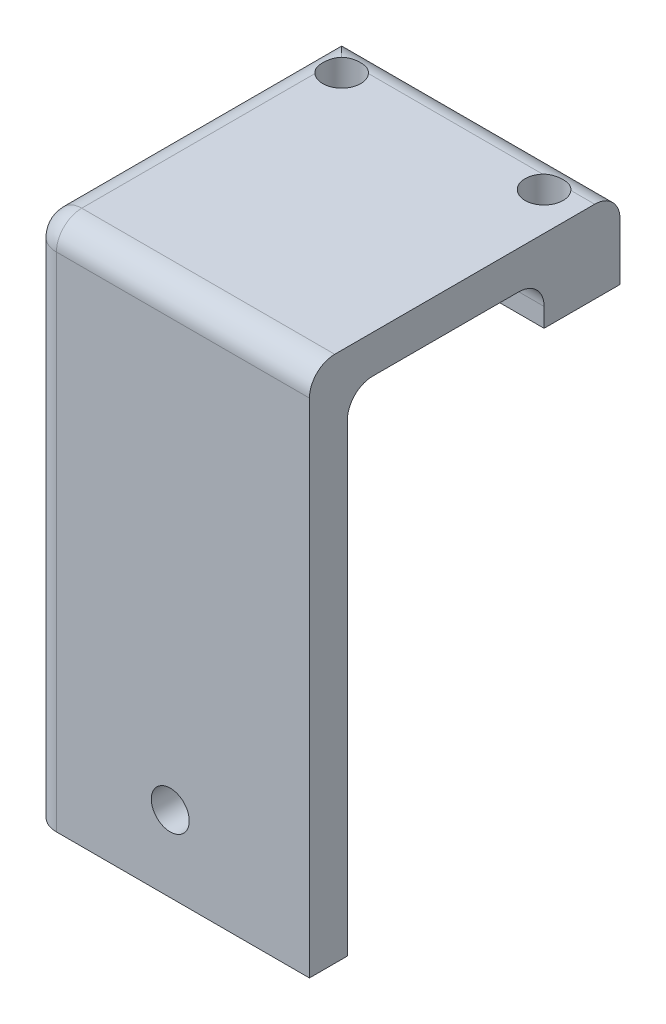
ISO-10303-21;
HEADER;
FILE_DESCRIPTION(('STEP AP214'),'2;1');
FILE_NAME('part.step','',(''),(''),'','','');
FILE_SCHEMA(('AUTOMOTIVE_DESIGN { 1 0 10303 214 1 1 1 1 }'));
ENDSEC;
DATA;
#1=APPLICATION_CONTEXT('core data for automotive mechanical design processes');
#2=APPLICATION_PROTOCOL_DEFINITION('international standard','automotive_design',2000,#1);
#3=PRODUCT_CONTEXT('',#1,'mechanical');
#4=PRODUCT('Part','Part','',(#3));
#5=PRODUCT_RELATED_PRODUCT_CATEGORY('part','',(#4));
#6=PRODUCT_DEFINITION_FORMATION('','',#4);
#7=PRODUCT_DEFINITION_CONTEXT('part definition',#1,'design');
#8=PRODUCT_DEFINITION('design','',#6,#7);
#9=PRODUCT_DEFINITION_SHAPE('','',#8);
#10=(LENGTH_UNIT() NAMED_UNIT(*) SI_UNIT(.MILLI.,.METRE.));
#11=(NAMED_UNIT(*) PLANE_ANGLE_UNIT() SI_UNIT($,.RADIAN.));
#12=(NAMED_UNIT(*) SI_UNIT($,.STERADIAN.) SOLID_ANGLE_UNIT());
#13=UNCERTAINTY_MEASURE_WITH_UNIT(LENGTH_MEASURE(1.E-05),#10,'distance_accuracy_value','');
#14=(GEOMETRIC_REPRESENTATION_CONTEXT(3) GLOBAL_UNCERTAINTY_ASSIGNED_CONTEXT((#13)) GLOBAL_UNIT_ASSIGNED_CONTEXT((#10,
#11,#12)) REPRESENTATION_CONTEXT('',''));
#15=CARTESIAN_POINT('',(0.,0.,0.));
#16=DIRECTION('',(0.,0.,1.));
#17=DIRECTION('',(1.,0.,0.));
#18=AXIS2_PLACEMENT_3D('',#15,#16,#17);
#19=CARTESIAN_POINT('',(11.,0.,-1.5));
#20=DIRECTION('',(0.,0.,-1.));
#21=DIRECTION('',(0.,1.,0.));
#22=AXIS2_PLACEMENT_3D('',#19,#20,#21);
#23=PLANE('',#22);
#24=CARTESIAN_POINT('',(0.,-14.85,-1.5));
#25=DIRECTION('',(0.,0.,-1.));
#26=DIRECTION('',(0.,1.,0.));
#27=AXIS2_PLACEMENT_3D('',#24,#25,#26);
#28=CIRCLE('',#27,1.5);
#29=CARTESIAN_POINT('',(0.,-13.35,-1.5));
#30=VERTEX_POINT('',#29);
#31=EDGE_CURVE('E191',#30,#30,#28,.T.);
#32=ORIENTED_EDGE('',*,*,#31,.F.);
#33=EDGE_LOOP('',(#32));
#34=FACE_BOUND('',#33,.T.);
#35=DIRECTION('',(0.,-1.,0.));
#36=VECTOR('',#35,1.);
#37=CARTESIAN_POINT('',(-11.,0.,-1.5));
#38=LINE('',#37,#36);
#39=CARTESIAN_POINT('',(-11.,15.85,-1.5));
#40=VERTEX_POINT('',#39);
#41=CARTESIAN_POINT('',(-11.,-20.85,-1.5));
#42=VERTEX_POINT('',#41);
#43=EDGE_CURVE('E187',#40,#42,#38,.T.);
#44=ORIENTED_EDGE('',*,*,#43,.F.);
#45=DIRECTION('',(-1.,0.,0.));
#46=VECTOR('',#45,1.);
#47=CARTESIAN_POINT('',(11.,15.85,-1.5));
#48=LINE('',#47,#46);
#49=CARTESIAN_POINT('',(11.,15.85,-1.5));
#50=VERTEX_POINT('',#49);
#51=EDGE_CURVE('E214',#40,#50,#48,.F.);
#52=ORIENTED_EDGE('',*,*,#51,.T.);
#53=DIRECTION('',(0.,-1.,0.));
#54=VECTOR('',#53,1.);
#55=CARTESIAN_POINT('',(11.,0.,-1.5));
#56=LINE('',#55,#54);
#57=CARTESIAN_POINT('',(11.,-20.85,-1.5));
#58=VERTEX_POINT('',#57);
#59=EDGE_CURVE('E201',#50,#58,#56,.T.);
#60=ORIENTED_EDGE('',*,*,#59,.T.);
#61=DIRECTION('',(-1.,0.,0.));
#62=VECTOR('',#61,1.);
#63=CARTESIAN_POINT('',(11.,-20.85,-1.5));
#64=LINE('',#63,#62);
#65=EDGE_CURVE('E186',#58,#42,#64,.T.);
#66=ORIENTED_EDGE('',*,*,#65,.T.);
#67=EDGE_LOOP('',(#44,#52,#60,#66));
#68=FACE_BOUND('',#67,.T.);
#69=ADVANCED_FACE('F35',(#34,#68),#23,.T.);
#70=CARTESIAN_POINT('',(11.,17.85,0.));
#71=DIRECTION('',(0.,1.,0.));
#72=DIRECTION('',(0.,0.,1.));
#73=AXIS2_PLACEMENT_3D('',#70,#71,#72);
#74=PLANE('',#73);
#75=DIRECTION('',(0.,0.,-1.));
#76=VECTOR('',#75,1.);
#77=CARTESIAN_POINT('',(-11.,17.85,0.));
#78=LINE('',#77,#76);
#79=CARTESIAN_POINT('',(-11.,17.85,-3.5));
#80=VERTEX_POINT('',#79);
#81=CARTESIAN_POINT('',(-11.,17.85,-15.05));
#82=VERTEX_POINT('',#81);
#83=EDGE_CURVE('E190',#80,#82,#78,.T.);
#84=ORIENTED_EDGE('',*,*,#83,.T.);
#85=DIRECTION('',(-1.,0.,0.));
#86=VECTOR('',#85,1.);
#87=CARTESIAN_POINT('',(11.,17.85,-15.05));
#88=LINE('',#87,#86);
#89=CARTESIAN_POINT('',(11.,17.85,-15.05));
#90=VERTEX_POINT('',#89);
#91=EDGE_CURVE('E212',#82,#90,#88,.F.);
#92=ORIENTED_EDGE('',*,*,#91,.T.);
#93=DIRECTION('',(0.,0.,-1.));
#94=VECTOR('',#93,1.);
#95=CARTESIAN_POINT('',(11.,17.85,0.));
#96=LINE('',#95,#94);
#97=CARTESIAN_POINT('',(11.,17.85,-3.5));
#98=VERTEX_POINT('',#97);
#99=EDGE_CURVE('E157',#98,#90,#96,.T.);
#100=ORIENTED_EDGE('',*,*,#99,.F.);
#101=DIRECTION('',(-1.,0.,0.));
#102=VECTOR('',#101,1.);
#103=CARTESIAN_POINT('',(11.,17.85,-3.5));
#104=LINE('',#103,#102);
#105=EDGE_CURVE('E209',#98,#80,#104,.T.);
#106=ORIENTED_EDGE('',*,*,#105,.T.);
#107=EDGE_LOOP('',(#84,#92,#100,#106));
#108=FACE_BOUND('',#107,.T.);
#109=ADVANCED_FACE('F284',(#108),#74,.F.);
#110=CARTESIAN_POINT('',(11.,0.,-17.05));
#111=DIRECTION('',(0.,0.,-1.));
#112=DIRECTION('',(-1.,0.,0.));
#113=AXIS2_PLACEMENT_3D('',#110,#111,#112);
#114=PLANE('',#113);
#115=DIRECTION('',(0.,-1.,0.));
#116=VECTOR('',#115,1.);
#117=CARTESIAN_POINT('',(11.,0.,-17.05));
#118=LINE('',#117,#116);
#119=CARTESIAN_POINT('',(11.,15.85,-17.05));
#120=VERTEX_POINT('',#119);
#121=CARTESIAN_POINT('',(11.,14.35,-17.05));
#122=VERTEX_POINT('',#121);
#123=EDGE_CURVE('E146',#120,#122,#118,.T.);
#124=ORIENTED_EDGE('',*,*,#123,.F.);
#125=DIRECTION('',(-1.,0.,0.));
#126=VECTOR('',#125,1.);
#127=CARTESIAN_POINT('',(-11.,15.85,-17.05));
#128=LINE('',#127,#126);
#129=CARTESIAN_POINT('',(-11.,15.85,-17.05));
#130=VERTEX_POINT('',#129);
#131=EDGE_CURVE('E167',#120,#130,#128,.T.);
#132=ORIENTED_EDGE('',*,*,#131,.T.);
#133=DIRECTION('',(0.,-1.,0.));
#134=VECTOR('',#133,1.);
#135=CARTESIAN_POINT('',(-11.,0.,-17.05));
#136=LINE('',#135,#134);
#137=CARTESIAN_POINT('',(-11.,14.35,-17.05));
#138=VERTEX_POINT('',#137);
#139=EDGE_CURVE('E163',#130,#138,#136,.T.);
#140=ORIENTED_EDGE('',*,*,#139,.T.);
#141=DIRECTION('',(-1.,0.,0.));
#142=VECTOR('',#141,1.);
#143=CARTESIAN_POINT('',(11.,14.35,-17.05));
#144=LINE('',#143,#142);
#145=EDGE_CURVE('E160',#122,#138,#144,.T.);
#146=ORIENTED_EDGE('',*,*,#145,.F.);
#147=EDGE_LOOP('',(#124,#132,#140,#146));
#148=FACE_BOUND('',#147,.T.);
#149=ADVANCED_FACE('F161',(#148),#114,.F.);
#150=CARTESIAN_POINT('',(11.,14.35,0.));
#151=DIRECTION('',(0.,-1.,0.));
#152=DIRECTION('',(0.,0.,-1.));
#153=AXIS2_PLACEMENT_3D('',#150,#151,#152);
#154=PLANE('',#153);
#155=CARTESIAN_POINT('',(-8.,14.35,-20.05));
#156=DIRECTION('',(0.,-1.,0.));
#157=DIRECTION('',(0.,0.,-1.));
#158=AXIS2_PLACEMENT_3D('',#155,#156,#157);
#159=CIRCLE('',#158,1.5);
#160=CARTESIAN_POINT('',(-8.,14.35,-21.55));
#161=VERTEX_POINT('',#160);
#162=EDGE_CURVE('E386',#161,#161,#159,.T.);
#163=ORIENTED_EDGE('',*,*,#162,.F.);
#164=EDGE_LOOP('',(#163));
#165=FACE_BOUND('',#164,.T.);
#166=CARTESIAN_POINT('',(8.,14.35,-20.05));
#167=DIRECTION('',(0.,-1.,0.));
#168=DIRECTION('',(0.,0.,-1.));
#169=AXIS2_PLACEMENT_3D('',#166,#167,#168);
#170=CIRCLE('',#169,1.5);
#171=CARTESIAN_POINT('',(8.,14.35,-21.55));
#172=VERTEX_POINT('',#171);
#173=EDGE_CURVE('E352',#172,#172,#170,.T.);
#174=ORIENTED_EDGE('',*,*,#173,.F.);
#175=EDGE_LOOP('',(#174));
#176=FACE_BOUND('',#175,.T.);
#177=DIRECTION('',(0.,0.,1.));
#178=VECTOR('',#177,1.);
#179=CARTESIAN_POINT('',(-11.,14.35,0.));
#180=LINE('',#179,#178);
#181=CARTESIAN_POINT('',(-11.,14.35,-23.05));
#182=VERTEX_POINT('',#181);
#183=EDGE_CURVE('E195',#182,#138,#180,.T.);
#184=ORIENTED_EDGE('',*,*,#183,.F.);
#185=DIRECTION('',(-1.,0.,0.));
#186=VECTOR('',#185,1.);
#187=CARTESIAN_POINT('',(11.,14.35,-23.05));
#188=LINE('',#187,#186);
#189=CARTESIAN_POINT('',(11.,14.35,-23.05));
#190=VERTEX_POINT('',#189);
#191=EDGE_CURVE('E168',#190,#182,#188,.T.);
#192=ORIENTED_EDGE('',*,*,#191,.F.);
#193=DIRECTION('',(0.,0.,1.));
#194=VECTOR('',#193,1.);
#195=CARTESIAN_POINT('',(11.,14.35,0.));
#196=LINE('',#195,#194);
#197=EDGE_CURVE('E150',#190,#122,#196,.T.);
#198=ORIENTED_EDGE('',*,*,#197,.T.);
#199=ORIENTED_EDGE('',*,*,#145,.T.);
#200=EDGE_LOOP('',(#184,#192,#198,#199));
#201=FACE_BOUND('',#200,.T.);
#202=ADVANCED_FACE('F171',(#165,#176,#201),#154,.T.);
#203=CARTESIAN_POINT('',(11.,0.,-23.05));
#204=DIRECTION('',(0.,0.,-1.));
#205=DIRECTION('',(-1.,0.,0.));
#206=AXIS2_PLACEMENT_3D('',#203,#204,#205);
#207=PLANE('',#206);
#208=DIRECTION('',(0.,-1.,0.));
#209=VECTOR('',#208,1.);
#210=CARTESIAN_POINT('',(-11.,0.,-23.05));
#211=LINE('',#210,#209);
#212=CARTESIAN_POINT('',(-11.,18.85,-23.05));
#213=VERTEX_POINT('',#212);
#214=EDGE_CURVE('E197',#213,#182,#211,.T.);
#215=ORIENTED_EDGE('',*,*,#214,.F.);
#216=DIRECTION('',(-1.,0.,0.));
#217=VECTOR('',#216,1.);
#218=CARTESIAN_POINT('',(11.,18.85,-23.05));
#219=LINE('',#218,#217);
#220=CARTESIAN_POINT('',(11.,18.85,-23.05));
#221=VERTEX_POINT('',#220);
#222=EDGE_CURVE('E53',#213,#221,#219,.F.);
#223=ORIENTED_EDGE('',*,*,#222,.T.);
#224=DIRECTION('',(0.,-1.,0.));
#225=VECTOR('',#224,1.);
#226=CARTESIAN_POINT('',(11.,0.,-23.05));
#227=LINE('',#226,#225);
#228=EDGE_CURVE('E173',#221,#190,#227,.T.);
#229=ORIENTED_EDGE('',*,*,#228,.T.);
#230=ORIENTED_EDGE('',*,*,#191,.T.);
#231=EDGE_LOOP('',(#215,#223,#229,#230));
#232=FACE_BOUND('',#231,.T.);
#233=ADVANCED_FACE('F275',(#232),#207,.T.);
#234=CARTESIAN_POINT('',(11.,20.85,0.));
#235=DIRECTION('',(0.,1.,0.));
#236=DIRECTION('',(0.,0.,1.));
#237=AXIS2_PLACEMENT_3D('',#234,#235,#236);
#238=PLANE('',#237);
#239=DIRECTION('',(0.,0.,-1.));
#240=VECTOR('',#239,1.);
#241=CARTESIAN_POINT('',(11.,20.85,0.));
#242=LINE('',#241,#240);
#243=CARTESIAN_POINT('',(11.,20.85,-0.499999999999998));
#244=VERTEX_POINT('',#243);
#245=CARTESIAN_POINT('',(11.,20.85,-21.05));
#246=VERTEX_POINT('',#245);
#247=EDGE_CURVE('E175',#244,#246,#242,.T.);
#248=ORIENTED_EDGE('',*,*,#247,.T.);
#249=DIRECTION('',(-1.,0.,0.));
#250=VECTOR('',#249,1.);
#251=CARTESIAN_POINT('',(11.,20.85,-21.05));
#252=LINE('',#251,#250);
#253=CARTESIAN_POINT('',(9.1180339887499,20.85,-21.05));
#254=VERTEX_POINT('',#253);
#255=EDGE_CURVE('E233',#246,#254,#252,.T.);
#256=ORIENTED_EDGE('',*,*,#255,.T.);
#257=CARTESIAN_POINT('',(8.,20.85,-20.05));
#258=DIRECTION('',(0.,1.,0.));
#259=DIRECTION('',(0.,0.,-1.));
#260=AXIS2_PLACEMENT_3D('',#257,#258,#259);
#261=CIRCLE('',#260,1.5);
#262=CARTESIAN_POINT('',(6.8819660112501,20.85,-21.05));
#263=VERTEX_POINT('',#262);
#264=EDGE_CURVE('E324',#263,#254,#261,.T.);
#265=ORIENTED_EDGE('',*,*,#264,.F.);
#266=DIRECTION('',(-1.,0.,0.));
#267=VECTOR('',#266,1.);
#268=CARTESIAN_POINT('',(11.,20.85,-21.05));
#269=LINE('',#268,#267);
#270=CARTESIAN_POINT('',(-6.8819660112501,20.85,-21.05));
#271=VERTEX_POINT('',#270);
#272=EDGE_CURVE('E231',#263,#271,#269,.T.);
#273=ORIENTED_EDGE('',*,*,#272,.T.);
#274=CARTESIAN_POINT('',(-8.,20.85,-20.05));
#275=DIRECTION('',(0.,1.,0.));
#276=DIRECTION('',(0.,0.,1.));
#277=AXIS2_PLACEMENT_3D('',#274,#275,#276);
#278=CIRCLE('',#277,1.5);
#279=CARTESIAN_POINT('',(-9.,20.85,-18.9319660112501));
#280=VERTEX_POINT('',#279);
#281=EDGE_CURVE('E327',#280,#271,#278,.T.);
#282=ORIENTED_EDGE('',*,*,#281,.F.);
#283=DIRECTION('',(0.,0.,-1.));
#284=VECTOR('',#283,1.);
#285=CARTESIAN_POINT('',(-9.,20.85,1.5));
#286=LINE('',#285,#284);
#287=CARTESIAN_POINT('',(-9.,20.85,-0.499999999999998));
#288=VERTEX_POINT('',#287);
#289=EDGE_CURVE('E229',#280,#288,#286,.F.);
#290=ORIENTED_EDGE('',*,*,#289,.T.);
#291=DIRECTION('',(-1.,0.,0.));
#292=VECTOR('',#291,1.);
#293=CARTESIAN_POINT('',(11.,20.85,-0.499999999999998));
#294=LINE('',#293,#292);
#295=EDGE_CURVE('E227',#288,#244,#294,.F.);
#296=ORIENTED_EDGE('',*,*,#295,.T.);
#297=EDGE_LOOP('',(#248,#256,#265,#273,#282,#290,#296));
#298=FACE_BOUND('',#297,.T.);
#299=ADVANCED_FACE('F271',(#298),#238,.T.);
#300=CARTESIAN_POINT('',(11.,0.,1.5));
#301=DIRECTION('',(0.,0.,-1.));
#302=DIRECTION('',(0.,1.,0.));
#303=AXIS2_PLACEMENT_3D('',#300,#301,#302);
#304=PLANE('',#303);
#305=CARTESIAN_POINT('',(0.,-14.85,1.5));
#306=DIRECTION('',(0.,0.,1.));
#307=DIRECTION('',(1.,0.,0.));
#308=AXIS2_PLACEMENT_3D('',#305,#306,#307);
#309=CIRCLE('',#308,1.5);
#310=CARTESIAN_POINT('',(1.5,-14.85,1.5));
#311=VERTEX_POINT('',#310);
#312=EDGE_CURVE('E383',#311,#311,#309,.T.);
#313=ORIENTED_EDGE('',*,*,#312,.F.);
#314=EDGE_LOOP('',(#313));
#315=FACE_BOUND('',#314,.T.);
#316=DIRECTION('',(-1.,0.,0.));
#317=VECTOR('',#316,1.);
#318=CARTESIAN_POINT('',(-11.,18.85,1.5));
#319=LINE('',#318,#317);
#320=CARTESIAN_POINT('',(11.,18.85,1.5));
#321=VERTEX_POINT('',#320);
#322=CARTESIAN_POINT('',(-9.,18.85,1.5));
#323=VERTEX_POINT('',#322);
#324=EDGE_CURVE('E216',#321,#323,#319,.T.);
#325=ORIENTED_EDGE('',*,*,#324,.T.);
#326=DIRECTION('',(0.,-1.,0.));
#327=VECTOR('',#326,1.);
#328=CARTESIAN_POINT('',(-9.,0.,1.5));
#329=LINE('',#328,#327);
#330=CARTESIAN_POINT('',(-9.,-20.85,1.5));
#331=VERTEX_POINT('',#330);
#332=EDGE_CURVE('E218',#323,#331,#329,.T.);
#333=ORIENTED_EDGE('',*,*,#332,.T.);
#334=DIRECTION('',(-1.,0.,0.));
#335=VECTOR('',#334,1.);
#336=CARTESIAN_POINT('',(11.,-20.85,1.5));
#337=LINE('',#336,#335);
#338=CARTESIAN_POINT('',(11.,-20.85,1.5));
#339=VERTEX_POINT('',#338);
#340=EDGE_CURVE('E204',#339,#331,#337,.T.);
#341=ORIENTED_EDGE('',*,*,#340,.F.);
#342=DIRECTION('',(0.,-1.,0.));
#343=VECTOR('',#342,1.);
#344=CARTESIAN_POINT('',(11.,0.,1.5));
#345=LINE('',#344,#343);
#346=EDGE_CURVE('E181',#321,#339,#345,.T.);
#347=ORIENTED_EDGE('',*,*,#346,.F.);
#348=EDGE_LOOP('',(#325,#333,#341,#347));
#349=FACE_BOUND('',#348,.T.);
#350=ADVANCED_FACE('F267',(#315,#349),#304,.F.);
#351=CARTESIAN_POINT('',(11.,-20.85,0.));
#352=DIRECTION('',(0.,1.,0.));
#353=DIRECTION('',(0.,0.,1.));
#354=AXIS2_PLACEMENT_3D('',#351,#352,#353);
#355=PLANE('',#354);
#356=ORIENTED_EDGE('',*,*,#340,.T.);
#357=CARTESIAN_POINT('',(-9.,-20.85,-0.500000000000003));
#358=DIRECTION('',(0.,1.,0.));
#359=DIRECTION('',(0.,0.,1.));
#360=AXIS2_PLACEMENT_3D('',#357,#358,#359);
#361=CIRCLE('',#360,2.);
#362=CARTESIAN_POINT('',(-11.,-20.85,-0.500000000000003));
#363=VERTEX_POINT('',#362);
#364=EDGE_CURVE('E221',#331,#363,#361,.F.);
#365=ORIENTED_EDGE('',*,*,#364,.T.);
#366=DIRECTION('',(0.,0.,-1.));
#367=VECTOR('',#366,1.);
#368=CARTESIAN_POINT('',(-11.,-20.85,0.));
#369=LINE('',#368,#367);
#370=EDGE_CURVE('E199',#363,#42,#369,.T.);
#371=ORIENTED_EDGE('',*,*,#370,.T.);
#372=ORIENTED_EDGE('',*,*,#65,.F.);
#373=DIRECTION('',(0.,0.,-1.));
#374=VECTOR('',#373,1.);
#375=CARTESIAN_POINT('',(11.,-20.85,0.));
#376=LINE('',#375,#374);
#377=EDGE_CURVE('E183',#339,#58,#376,.T.);
#378=ORIENTED_EDGE('',*,*,#377,.F.);
#379=EDGE_LOOP('',(#356,#365,#371,#372,#378));
#380=FACE_BOUND('',#379,.T.);
#381=ADVANCED_FACE('F261',(#380),#355,.F.);
#382=CARTESIAN_POINT('',(11.,0.,0.));
#383=DIRECTION('',(1.,0.,0.));
#384=DIRECTION('',(0.,0.,-1.));
#385=AXIS2_PLACEMENT_3D('',#382,#383,#384);
#386=PLANE('',#385);
#387=ORIENTED_EDGE('',*,*,#228,.F.);
#388=CARTESIAN_POINT('',(11.,18.85,-21.05));
#389=DIRECTION('',(1.,0.,0.));
#390=DIRECTION('',(0.,0.,-1.));
#391=AXIS2_PLACEMENT_3D('',#388,#389,#390);
#392=CIRCLE('',#391,2.);
#393=EDGE_CURVE('E341',#221,#246,#392,.T.);
#394=ORIENTED_EDGE('',*,*,#393,.T.);
#395=ORIENTED_EDGE('',*,*,#247,.F.);
#396=CARTESIAN_POINT('',(11.,18.85,-0.499999999999998));
#397=DIRECTION('',(1.,0.,0.));
#398=DIRECTION('',(0.,0.,-1.));
#399=AXIS2_PLACEMENT_3D('',#396,#397,#398);
#400=CIRCLE('',#399,2.);
#401=EDGE_CURVE('E343',#244,#321,#400,.T.);
#402=ORIENTED_EDGE('',*,*,#401,.T.);
#403=ORIENTED_EDGE('',*,*,#346,.T.);
#404=ORIENTED_EDGE('',*,*,#377,.T.);
#405=ORIENTED_EDGE('',*,*,#59,.F.);
#406=CARTESIAN_POINT('',(11.,15.85,-3.5));
#407=DIRECTION('',(1.,0.,0.));
#408=DIRECTION('',(0.,0.,-1.));
#409=AXIS2_PLACEMENT_3D('',#406,#407,#408);
#410=CIRCLE('',#409,2.);
#411=EDGE_CURVE('E11',#50,#98,#410,.F.);
#412=ORIENTED_EDGE('',*,*,#411,.T.);
#413=ORIENTED_EDGE('',*,*,#99,.T.);
#414=CARTESIAN_POINT('',(11.,15.85,-15.05));
#415=DIRECTION('',(1.,0.,0.));
#416=DIRECTION('',(0.,0.,-1.));
#417=AXIS2_PLACEMENT_3D('',#414,#415,#416);
#418=CIRCLE('',#417,2.);
#419=EDGE_CURVE('E153',#90,#120,#418,.F.);
#420=ORIENTED_EDGE('',*,*,#419,.T.);
#421=ORIENTED_EDGE('',*,*,#123,.T.);
#422=ORIENTED_EDGE('',*,*,#197,.F.);
#423=EDGE_LOOP('',(#387,#394,#395,#402,#403,#404,#405,#412,#413,#420,#421,#422));
#424=FACE_BOUND('',#423,.T.);
#425=ADVANCED_FACE('F148',(#424),#386,.T.);
#426=CARTESIAN_POINT('',(-11.,0.,0.));
#427=DIRECTION('',(1.,0.,0.));
#428=DIRECTION('',(0.,0.,-1.));
#429=AXIS2_PLACEMENT_3D('',#426,#427,#428);
#430=PLANE('',#429);
#431=ORIENTED_EDGE('',*,*,#370,.F.);
#432=DIRECTION('',(0.,-1.,0.));
#433=VECTOR('',#432,1.);
#434=CARTESIAN_POINT('',(-11.,0.,-0.5));
#435=LINE('',#434,#433);
#436=CARTESIAN_POINT('',(-11.,18.85,-0.499999999999998));
#437=VERTEX_POINT('',#436);
#438=EDGE_CURVE('E225',#363,#437,#435,.F.);
#439=ORIENTED_EDGE('',*,*,#438,.T.);
#440=DIRECTION('',(0.,0.,-1.));
#441=VECTOR('',#440,1.);
#442=CARTESIAN_POINT('',(-11.,18.85,-23.05));
#443=LINE('',#442,#441);
#444=EDGE_CURVE('E223',#437,#213,#443,.T.);
#445=ORIENTED_EDGE('',*,*,#444,.T.);
#446=ORIENTED_EDGE('',*,*,#214,.T.);
#447=ORIENTED_EDGE('',*,*,#183,.T.);
#448=ORIENTED_EDGE('',*,*,#139,.F.);
#449=CARTESIAN_POINT('',(-11.,15.85,-15.05));
#450=DIRECTION('',(1.,0.,0.));
#451=DIRECTION('',(0.,0.,-1.));
#452=AXIS2_PLACEMENT_3D('',#449,#450,#451);
#453=CIRCLE('',#452,2.);
#454=EDGE_CURVE('E339',#130,#82,#453,.T.);
#455=ORIENTED_EDGE('',*,*,#454,.T.);
#456=ORIENTED_EDGE('',*,*,#83,.F.);
#457=CARTESIAN_POINT('',(-11.,15.85,-3.5));
#458=DIRECTION('',(1.,0.,0.));
#459=DIRECTION('',(0.,0.,-1.));
#460=AXIS2_PLACEMENT_3D('',#457,#458,#459);
#461=CIRCLE('',#460,2.);
#462=EDGE_CURVE('E45',#80,#40,#461,.T.);
#463=ORIENTED_EDGE('',*,*,#462,.T.);
#464=ORIENTED_EDGE('',*,*,#43,.T.);
#465=EDGE_LOOP('',(#431,#439,#445,#446,#447,#448,#455,#456,#463,#464));
#466=FACE_BOUND('',#465,.T.);
#467=ADVANCED_FACE('F257',(#466),#430,.F.);
#468=CARTESIAN_POINT('',(0.,-14.85,-8.5));
#469=DIRECTION('',(0.,0.,1.));
#470=DIRECTION('',(1.,0.,0.));
#471=AXIS2_PLACEMENT_3D('',#468,#469,#470);
#472=CYLINDRICAL_SURFACE('',#471,1.5);
#473=ORIENTED_EDGE('',*,*,#31,.T.);
#474=EDGE_LOOP('',(#473));
#475=FACE_BOUND('',#474,.T.);
#476=ORIENTED_EDGE('',*,*,#312,.T.);
#477=EDGE_LOOP('',(#476));
#478=FACE_BOUND('',#477,.T.);
#479=ADVANCED_FACE('F252',(#475,#478),#472,.F.);
#480=CARTESIAN_POINT('',(8.,10.85,-20.05));
#481=DIRECTION('',(0.,1.,0.));
#482=DIRECTION('',(0.,0.,1.));
#483=AXIS2_PLACEMENT_3D('',#480,#481,#482);
#484=CYLINDRICAL_SURFACE('',#483,1.5);
#485=ORIENTED_EDGE('',*,*,#173,.T.);
#486=EDGE_LOOP('',(#485));
#487=FACE_BOUND('',#486,.T.);
#488=ORIENTED_EDGE('',*,*,#264,.T.);
#489=CARTESIAN_POINT('',(9.1180339887499,20.85,-21.05));
#490=CARTESIAN_POINT('',(9.09014712979199,20.8499999665618,-21.0811799330788));
#491=CARTESIAN_POINT('',(9.06097394949691,20.8492709939732,-21.1111690646517));
#492=CARTESIAN_POINT('',(9.00026794816766,20.8466884986536,-21.1685744613742));
#493=CARTESIAN_POINT('',(8.96873626678634,20.8448355160178,-21.1959919549138));
#494=CARTESIAN_POINT('',(8.87098679185593,20.8380961032748,-21.2740587924033));
#495=CARTESIAN_POINT('',(8.80152245255639,20.8320270370178,-21.3206251614001));
#496=CARTESIAN_POINT('',(8.65598962129603,20.8192932777055,-21.4015225349234));
#497=CARTESIAN_POINT('',(8.57992697627891,20.8126291118336,-21.4358642370752));
#498=CARTESIAN_POINT('',(8.42305337910308,20.8008675549985,-21.4915074064366));
#499=CARTESIAN_POINT('',(8.3422435996731,20.7957697789982,-21.5128120795804));
#500=CARTESIAN_POINT('',(8.17720919430147,20.7886316876221,-21.5418739449176));
#501=CARTESIAN_POINT('',(8.09295784307508,20.7866236324242,-21.5494883316641));
#502=CARTESIAN_POINT('',(7.92437348874521,20.786372639611,-21.5504616054291));
#503=CARTESIAN_POINT('',(7.84004049424106,20.7881293411678,-21.5438218586151));
#504=CARTESIAN_POINT('',(7.67619625409528,20.794779374718,-21.5169177039406));
#505=CARTESIAN_POINT('',(7.59661608825884,20.7995819215293,-21.4970468377524));
#506=CARTESIAN_POINT('',(7.44184700665016,20.8108509768024,-21.4446862227213));
#507=CARTESIAN_POINT('',(7.36665969333235,20.8173180878822,-21.4121919016659));
#508=CARTESIAN_POINT('',(7.21720202313403,20.8303816019739,-21.3325360885784));
#509=CARTESIAN_POINT('',(7.14340287283963,20.8369527336011,-21.2844740643096));
#510=CARTESIAN_POINT('',(7.03975950253838,20.844309095994,-21.2032033956782));
#511=CARTESIAN_POINT('',(7.006353625945,20.8463453822699,-21.1745457134639));
#512=CARTESIAN_POINT('',(6.94214469817897,20.8491911044181,-21.1143674582555));
#513=CARTESIAN_POINT('',(6.91134288544694,20.8499999596137,-21.0828455377081));
#514=CARTESIAN_POINT('',(6.8819660112501,20.85,-21.05));
#515=B_SPLINE_CURVE_WITH_KNOTS('',3,(#489,#490,#491,#492,#493,#494,#495,#496,#497,#498,#499,
#500,#501,#502,#503,#504,#505,#506,#507,#508,#509,#510,#511,#512,#513,#514),.UNSPECIFIED.,.F.,
.F.,(4,2,2,2,2,2,2,2,2,2,2,2,4),(0.,0.125397644041447,0.250735081258052,0.501001621551559,
0.751048615773057,1.00103409623093,1.25361240915332,1.5061665151383,1.75152561203565,
1.99697366092298,2.26041347354054,2.39243416742391,2.52451729859244),.UNSPECIFIED.);
#516=EDGE_CURVE('E235',#254,#263,#515,.T.);
#517=ORIENTED_EDGE('',*,*,#516,.T.);
#518=EDGE_LOOP('',(#488,#517));
#519=FACE_BOUND('',#518,.T.);
#520=ADVANCED_FACE('F247',(#487,#519),#484,.F.);
#521=CARTESIAN_POINT('',(-8.,10.85,-20.05));
#522=DIRECTION('',(0.,1.,0.));
#523=DIRECTION('',(0.,0.,1.));
#524=AXIS2_PLACEMENT_3D('',#521,#522,#523);
#525=CYLINDRICAL_SURFACE('',#524,1.5);
#526=ORIENTED_EDGE('',*,*,#162,.T.);
#527=EDGE_LOOP('',(#526));
#528=FACE_BOUND('',#527,.T.);
#529=ORIENTED_EDGE('',*,*,#281,.T.);
#530=CARTESIAN_POINT('',(-6.8819660112501,20.85,-21.05));
#531=CARTESIAN_POINT('',(-6.9098526574449,20.8499999666048,-21.0811796934566));
#532=CARTESIAN_POINT('',(-6.93902560369593,20.8492710051717,-21.1111686045526));
#533=CARTESIAN_POINT('',(-6.99973110327567,20.8466885468081,-21.1685736019671));
#534=CARTESIAN_POINT('',(-7.03126251703196,20.8448355899356,-21.1959909165872));
#535=CARTESIAN_POINT('',(-7.129012144881,20.8380961964849,-21.274058076793));
#536=CARTESIAN_POINT('',(-7.19847699749782,20.8320270861701,-21.3206248452954));
#537=CARTESIAN_POINT('',(-7.34401115660928,20.8192932086082,-21.4015229777349));
#538=CARTESIAN_POINT('',(-7.42007463700202,20.8126289666685,-21.4358650011937));
#539=CARTESIAN_POINT('',(-7.57694840218781,20.8008674455413,-21.4915078465795));
#540=CARTESIAN_POINT('',(-7.65775741145307,20.7957697475653,-21.5128121554267));
#541=CARTESIAN_POINT('',(-7.82278765914397,20.7886318112896,-21.5418734940887));
#542=CARTESIAN_POINT('',(-7.9070355508007,20.7866237512721,-21.5494880826915));
#543=CARTESIAN_POINT('',(-8.0756207966235,20.786372539162,-21.5504617831858));
#544=CARTESIAN_POINT('',(-8.15995814868388,20.7881293003374,-21.5438212234803));
#545=CARTESIAN_POINT('',(-8.32381273869322,20.7947797258678,-21.5169170608843));
#546=CARTESIAN_POINT('',(-8.40339884464728,20.7995828961215,-21.4970456613593));
#547=CARTESIAN_POINT('',(-8.55817888800149,20.8108529762907,-21.4446735831537));
#548=CARTESIAN_POINT('',(-8.63337238716818,20.8173200518611,-21.4121716468398));
#549=CARTESIAN_POINT('',(-8.77062041916592,20.8293179690421,-21.3390291656388));
#550=CARTESIAN_POINT('',(-8.83324427071027,20.8348793214554,-21.2994583371604));
#551=CARTESIAN_POINT('',(-8.9520755410714,20.8439556930865,-21.211481968994));
#552=CARTESIAN_POINT('',(-9.00828429235079,20.8474711378781,-21.1630782694052));
#553=CARTESIAN_POINT('',(-9.06066017177982,20.8490798742321,-21.1106601717798));
#554=B_SPLINE_CURVE_WITH_KNOTS('',3,(#530,#531,#532,#533,#534,#535,#536,#537,#538,#539,#540,
#541,#542,#543,#544,#545,#546,#547,#548,#549,#550,#551,#552,#553),.UNSPECIFIED.,.F.,.F.,(4,2,2,
2,2,2,2,2,2,2,2,4),(0.,0.125396683662013,0.25073316433416,0.50100161655141,0.751051306358457,
1.00103409143168,1.25360321011947,1.50616651030839,1.75155786192808,1.99697365363425,
2.21901978945079,2.44101972042266),.UNSPECIFIED.);
#555=CARTESIAN_POINT('',(-9.06066017177982,20.8490798742321,-21.1106601717798));
#556=VERTEX_POINT('',#555);
#557=EDGE_CURVE('E61',#271,#556,#554,.T.);
#558=ORIENTED_EDGE('',*,*,#557,.T.);
#559=CARTESIAN_POINT('',(-9.06066017177982,20.8490798742321,-21.1106601717798));
#560=CARTESIAN_POINT('',(-9.09040583911708,20.8481765532099,-21.0809147350024));
#561=CARTESIAN_POINT('',(-9.11886961607298,20.8466492580258,-21.0499469917934));
#562=CARTESIAN_POINT('',(-9.1730655370391,20.8426832510064,-20.9857785190585));
#563=CARTESIAN_POINT('',(-9.19879864263902,20.8402448613844,-20.9525785823594));
#564=CARTESIAN_POINT('',(-9.27163738689338,20.8320705447783,-20.8499756443205));
#565=CARTESIAN_POINT('',(-9.31443589597214,20.8254726689411,-20.777515912263));
#566=CARTESIAN_POINT('',(-9.38732145896899,20.812488302146,-20.6265190528229));
#567=CARTESIAN_POINT('',(-9.41741235404894,20.8061017478501,-20.5479837704168));
#568=CARTESIAN_POINT('',(-9.46408191682726,20.7955604420057,-20.386875965911));
#569=CARTESIAN_POINT('',(-9.48066898736204,20.7914043031173,-20.3043059883882));
#570=CARTESIAN_POINT('',(-9.4997759469118,20.7865755459804,-20.1376706854954));
#571=CARTESIAN_POINT('',(-9.50233346234503,20.7858936104795,-20.0536099670183));
#572=CARTESIAN_POINT('',(-9.4933905668191,20.7881912694548,-19.8862727589764));
#573=CARTESIAN_POINT('',(-9.48188674451546,20.7911717524513,-19.8029964646566));
#574=CARTESIAN_POINT('',(-9.44561996168055,20.799809075759,-19.641482620361));
#575=CARTESIAN_POINT('',(-9.42115388423053,20.8054056723428,-19.563174562329));
#576=CARTESIAN_POINT('',(-9.35985453344797,20.8176066719626,-19.4116622583333));
#577=CARTESIAN_POINT('',(-9.32302369656059,20.8242108763123,-19.3384570103028));
#578=CARTESIAN_POINT('',(-9.24233865787734,20.8356359086954,-19.2062325990081));
#579=CARTESIAN_POINT('',(-9.19961820284125,20.8405709141585,-19.1465302300173));
#580=CARTESIAN_POINT('',(-9.10584128610515,20.8477488440132,-19.0338717474997));
#581=CARTESIAN_POINT('',(-9.05478151011434,20.8499906950943,-18.9809183311625));
#582=CARTESIAN_POINT('',(-9.,20.85,-18.9319660112501));
#583=B_SPLINE_CURVE_WITH_KNOTS('',3,(#559,#560,#561,#562,#563,#564,#565,#566,#567,#568,#569,
#570,#571,#572,#573,#574,#575,#576,#577,#578,#579,#580,#581,#582),.UNSPECIFIED.,.F.,.F.,(4,2,2,
2,2,2,2,2,2,2,2,4),(0.,0.126135110179043,0.252225654187883,0.504182478579722,0.75606308875293,
1.00778684463919,1.2588351613611,1.50994439563654,1.75553626493473,2.00107976934081,
2.22100397230858,2.44101579324964),.UNSPECIFIED.);
#584=EDGE_CURVE('E241',#556,#280,#583,.T.);
#585=ORIENTED_EDGE('',*,*,#584,.T.);
#586=EDGE_LOOP('',(#529,#558,#585));
#587=FACE_BOUND('',#586,.T.);
#588=ADVANCED_FACE('F251',(#528,#587),#525,.F.);
#589=CARTESIAN_POINT('',(11.,15.85,-15.05));
#590=DIRECTION('',(1.,0.,0.));
#591=DIRECTION('',(0.,0.,-1.));
#592=AXIS2_PLACEMENT_3D('',#589,#590,#591);
#593=CYLINDRICAL_SURFACE('',#592,2.);
#594=ORIENTED_EDGE('',*,*,#419,.F.);
#595=ORIENTED_EDGE('',*,*,#91,.F.);
#596=ORIENTED_EDGE('',*,*,#454,.F.);
#597=ORIENTED_EDGE('',*,*,#131,.F.);
#598=EDGE_LOOP('',(#594,#595,#596,#597));
#599=FACE_BOUND('',#598,.T.);
#600=ADVANCED_FACE('F291',(#599),#593,.F.);
#601=CARTESIAN_POINT('',(11.,15.85,-3.5));
#602=DIRECTION('',(-1.,0.,0.));
#603=DIRECTION('',(0.,0.,1.));
#604=AXIS2_PLACEMENT_3D('',#601,#602,#603);
#605=CYLINDRICAL_SURFACE('',#604,2.);
#606=ORIENTED_EDGE('',*,*,#411,.F.);
#607=ORIENTED_EDGE('',*,*,#51,.F.);
#608=ORIENTED_EDGE('',*,*,#462,.F.);
#609=ORIENTED_EDGE('',*,*,#105,.F.);
#610=EDGE_LOOP('',(#606,#607,#608,#609));
#611=FACE_BOUND('',#610,.T.);
#612=ADVANCED_FACE('F294',(#611),#605,.F.);
#613=CARTESIAN_POINT('',(11.,18.85,-21.05));
#614=DIRECTION('',(-1.,0.,0.));
#615=DIRECTION('',(0.,0.,1.));
#616=AXIS2_PLACEMENT_3D('',#613,#614,#615);
#617=CYLINDRICAL_SURFACE('',#616,2.);
#618=ORIENTED_EDGE('',*,*,#393,.F.);
#619=ORIENTED_EDGE('',*,*,#222,.F.);
#620=CARTESIAN_POINT('',(-9.,18.85,-21.05));
#621=DIRECTION('',(-0.707106781186547,0.,0.707106781186547));
#622=DIRECTION('',(0.707106781186547,0.,0.707106781186547));
#623=AXIS2_PLACEMENT_3D('',#620,#621,#622);
#624=ELLIPSE('',#623,2.82842712474619,2.);
#625=EDGE_CURVE('E40',#556,#213,#624,.T.);
#626=ORIENTED_EDGE('',*,*,#625,.F.);
#627=ORIENTED_EDGE('',*,*,#557,.F.);
#628=ORIENTED_EDGE('',*,*,#272,.F.);
#629=ORIENTED_EDGE('',*,*,#516,.F.);
#630=ORIENTED_EDGE('',*,*,#255,.F.);
#631=EDGE_LOOP('',(#618,#619,#626,#627,#628,#629,#630));
#632=FACE_BOUND('',#631,.T.);
#633=ADVANCED_FACE('F37',(#632),#617,.T.);
#634=CARTESIAN_POINT('',(-9.,18.85,0.));
#635=DIRECTION('',(0.,0.,1.));
#636=DIRECTION('',(1.,0.,0.));
#637=AXIS2_PLACEMENT_3D('',#634,#635,#636);
#638=CYLINDRICAL_SURFACE('',#637,2.);
#639=ORIENTED_EDGE('',*,*,#625,.T.);
#640=ORIENTED_EDGE('',*,*,#444,.F.);
#641=CARTESIAN_POINT('',(-9.,18.85,-0.499999999999998));
#642=DIRECTION('',(0.,0.,1.));
#643=DIRECTION('',(1.,0.,0.));
#644=AXIS2_PLACEMENT_3D('',#641,#642,#643);
#645=CIRCLE('',#644,2.);
#646=EDGE_CURVE('E325',#288,#437,#645,.T.);
#647=ORIENTED_EDGE('',*,*,#646,.F.);
#648=ORIENTED_EDGE('',*,*,#289,.F.);
#649=ORIENTED_EDGE('',*,*,#584,.F.);
#650=EDGE_LOOP('',(#639,#640,#647,#648,#649));
#651=FACE_BOUND('',#650,.T.);
#652=ADVANCED_FACE('F309',(#651),#638,.T.);
#653=CARTESIAN_POINT('',(11.,18.85,-0.499999999999998));
#654=DIRECTION('',(1.,0.,0.));
#655=DIRECTION('',(0.,0.,-1.));
#656=AXIS2_PLACEMENT_3D('',#653,#654,#655);
#657=CYLINDRICAL_SURFACE('',#656,2.);
#658=ORIENTED_EDGE('',*,*,#401,.F.);
#659=ORIENTED_EDGE('',*,*,#295,.F.);
#660=CARTESIAN_POINT('',(-9.,18.85,-0.499999999999998));
#661=DIRECTION('',(-1.,0.,0.));
#662=DIRECTION('',(0.,-1.,0.));
#663=AXIS2_PLACEMENT_3D('',#660,#661,#662);
#664=CIRCLE('',#663,2.);
#665=EDGE_CURVE('E329',#323,#288,#664,.T.);
#666=ORIENTED_EDGE('',*,*,#665,.F.);
#667=ORIENTED_EDGE('',*,*,#324,.F.);
#668=EDGE_LOOP('',(#658,#659,#666,#667));
#669=FACE_BOUND('',#668,.T.);
#670=ADVANCED_FACE('F306',(#669),#657,.T.);
#671=CARTESIAN_POINT('',(-9.,18.85,-0.499999999999998));
#672=DIRECTION('',(0.,0.,1.));
#673=DIRECTION('',(1.,0.,0.));
#674=AXIS2_PLACEMENT_3D('',#671,#672,#673);
#675=SPHERICAL_SURFACE('',#674,2.);
#676=ORIENTED_EDGE('',*,*,#665,.T.);
#677=ORIENTED_EDGE('',*,*,#646,.T.);
#678=CARTESIAN_POINT('',(-9.,18.85,-0.499999999999998));
#679=DIRECTION('',(0.,1.,0.));
#680=DIRECTION('',(0.,0.,1.));
#681=AXIS2_PLACEMENT_3D('',#678,#679,#680);
#682=CIRCLE('',#681,2.);
#683=EDGE_CURVE('E333',#323,#437,#682,.F.);
#684=ORIENTED_EDGE('',*,*,#683,.F.);
#685=EDGE_LOOP('',(#676,#677,#684));
#686=FACE_BOUND('',#685,.T.);
#687=ADVANCED_FACE('F302',(#686),#675,.T.);
#688=CARTESIAN_POINT('',(-9.,0.,-0.5));
#689=DIRECTION('',(0.,-1.,0.));
#690=DIRECTION('',(0.,0.,-1.));
#691=AXIS2_PLACEMENT_3D('',#688,#689,#690);
#692=CYLINDRICAL_SURFACE('',#691,2.);
#693=ORIENTED_EDGE('',*,*,#683,.T.);
#694=ORIENTED_EDGE('',*,*,#438,.F.);
#695=ORIENTED_EDGE('',*,*,#364,.F.);
#696=ORIENTED_EDGE('',*,*,#332,.F.);
#697=EDGE_LOOP('',(#693,#694,#695,#696));
#698=FACE_BOUND('',#697,.T.);
#699=ADVANCED_FACE('F299',(#698),#692,.T.);
#700=CLOSED_SHELL('',(#69,#109,#149,#202,#233,#299,#350,#381,#425,#467,#479,#520,#588,#600,#612,
#633,#652,#670,#687,#699));
#701=MANIFOLD_SOLID_BREP('B2',#700);
#702=ADVANCED_BREP_SHAPE_REPRESENTATION('',(#18,#701),#14);
#703=SHAPE_DEFINITION_REPRESENTATION(#9,#702);
ENDSEC;
END-ISO-10303-21;
